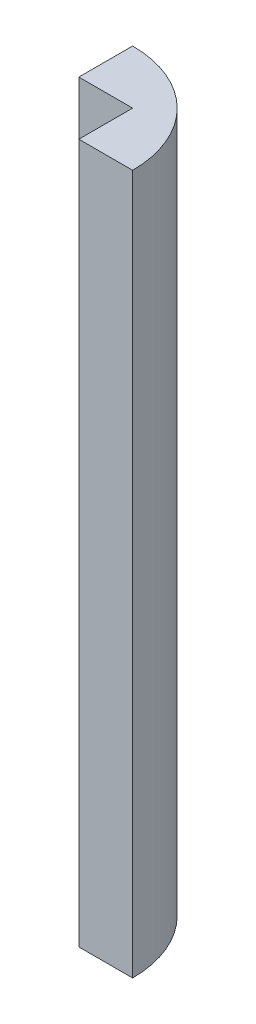
ISO-10303-21;
HEADER;
FILE_DESCRIPTION(('STEP AP214'),'2;1');
FILE_NAME('part.step','',(''),(''),'','','');
FILE_SCHEMA(('AUTOMOTIVE_DESIGN { 1 0 10303 214 1 1 1 1 }'));
ENDSEC;
DATA;
#1=APPLICATION_CONTEXT('core data for automotive mechanical design processes');
#2=APPLICATION_PROTOCOL_DEFINITION('international standard','automotive_design',2000,#1);
#3=PRODUCT_CONTEXT('',#1,'mechanical');
#4=PRODUCT('Part','Part','',(#3));
#5=PRODUCT_RELATED_PRODUCT_CATEGORY('part','',(#4));
#6=PRODUCT_DEFINITION_FORMATION('','',#4);
#7=PRODUCT_DEFINITION_CONTEXT('part definition',#1,'design');
#8=PRODUCT_DEFINITION('design','',#6,#7);
#9=PRODUCT_DEFINITION_SHAPE('','',#8);
#10=(LENGTH_UNIT() NAMED_UNIT(*) SI_UNIT(.MILLI.,.METRE.));
#11=(NAMED_UNIT(*) PLANE_ANGLE_UNIT() SI_UNIT($,.RADIAN.));
#12=(NAMED_UNIT(*) SI_UNIT($,.STERADIAN.) SOLID_ANGLE_UNIT());
#13=UNCERTAINTY_MEASURE_WITH_UNIT(LENGTH_MEASURE(1.E-05),#10,'distance_accuracy_value','');
#14=(GEOMETRIC_REPRESENTATION_CONTEXT(3) GLOBAL_UNCERTAINTY_ASSIGNED_CONTEXT((#13)) GLOBAL_UNIT_ASSIGNED_CONTEXT((#10,
#11,#12)) REPRESENTATION_CONTEXT('',''));
#15=CARTESIAN_POINT('',(0.,0.,0.));
#16=DIRECTION('',(0.,0.,1.));
#17=DIRECTION('',(1.,0.,0.));
#18=AXIS2_PLACEMENT_3D('',#15,#16,#17);
#19=CARTESIAN_POINT('',(10.,130.,0.));
#20=DIRECTION('',(1.,0.,0.));
#21=DIRECTION('',(0.,0.,-1.));
#22=AXIS2_PLACEMENT_3D('',#19,#20,#21);
#23=PLANE('',#22);
#24=DIRECTION('',(0.,0.,1.));
#25=VECTOR('',#24,1.);
#26=CARTESIAN_POINT('',(10.,0.,0.));
#27=LINE('',#26,#25);
#28=CARTESIAN_POINT('',(10.,0.,-10.));
#29=VERTEX_POINT('',#28);
#30=CARTESIAN_POINT('',(10.,0.,0.));
#31=VERTEX_POINT('',#30);
#32=EDGE_CURVE('E118',#29,#31,#27,.T.);
#33=ORIENTED_EDGE('',*,*,#32,.T.);
#34=DIRECTION('',(0.,-1.,0.));
#35=VECTOR('',#34,1.);
#36=CARTESIAN_POINT('',(10.,130.,0.));
#37=LINE('',#36,#35);
#38=CARTESIAN_POINT('',(10.,130.,0.));
#39=VERTEX_POINT('',#38);
#40=EDGE_CURVE('E11',#39,#31,#37,.T.);
#41=ORIENTED_EDGE('',*,*,#40,.F.);
#42=DIRECTION('',(0.,0.,1.));
#43=VECTOR('',#42,1.);
#44=CARTESIAN_POINT('',(10.,130.,0.));
#45=LINE('',#44,#43);
#46=CARTESIAN_POINT('',(10.,130.,-10.));
#47=VERTEX_POINT('',#46);
#48=EDGE_CURVE('E131',#47,#39,#45,.T.);
#49=ORIENTED_EDGE('',*,*,#48,.F.);
#50=DIRECTION('',(0.,-1.,0.));
#51=VECTOR('',#50,1.);
#52=CARTESIAN_POINT('',(10.,130.,-10.));
#53=LINE('',#52,#51);
#54=EDGE_CURVE('E114',#47,#29,#53,.T.);
#55=ORIENTED_EDGE('',*,*,#54,.T.);
#56=EDGE_LOOP('',(#33,#41,#49,#55));
#57=FACE_BOUND('',#56,.T.);
#58=ADVANCED_FACE('F39',(#57),#23,.F.);
#59=CARTESIAN_POINT('',(10.,130.,0.));
#60=DIRECTION('',(0.,0.,-1.));
#61=DIRECTION('',(-1.,0.,0.));
#62=AXIS2_PLACEMENT_3D('',#59,#60,#61);
#63=PLANE('',#62);
#64=DIRECTION('',(1.,0.,0.));
#65=VECTOR('',#64,1.);
#66=CARTESIAN_POINT('',(10.,0.,0.));
#67=LINE('',#66,#65);
#68=CARTESIAN_POINT('',(20.,0.,0.));
#69=VERTEX_POINT('',#68);
#70=EDGE_CURVE('E122',#31,#69,#67,.T.);
#71=ORIENTED_EDGE('',*,*,#70,.T.);
#72=DIRECTION('',(0.,-1.,0.));
#73=VECTOR('',#72,1.);
#74=CARTESIAN_POINT('',(20.,130.,0.));
#75=LINE('',#74,#73);
#76=CARTESIAN_POINT('',(20.,130.,0.));
#77=VERTEX_POINT('',#76);
#78=EDGE_CURVE('E48',#77,#69,#75,.T.);
#79=ORIENTED_EDGE('',*,*,#78,.F.);
#80=DIRECTION('',(1.,0.,0.));
#81=VECTOR('',#80,1.);
#82=CARTESIAN_POINT('',(10.,130.,0.));
#83=LINE('',#82,#81);
#84=EDGE_CURVE('E90',#39,#77,#83,.T.);
#85=ORIENTED_EDGE('',*,*,#84,.F.);
#86=ORIENTED_EDGE('',*,*,#40,.T.);
#87=EDGE_LOOP('',(#71,#79,#85,#86));
#88=FACE_BOUND('',#87,.T.);
#89=ADVANCED_FACE('F153',(#88),#63,.F.);
#90=CARTESIAN_POINT('',(0.,130.,0.));
#91=DIRECTION('',(0.,-1.,0.));
#92=DIRECTION('',(0.,0.,-1.));
#93=AXIS2_PLACEMENT_3D('',#90,#91,#92);
#94=CYLINDRICAL_SURFACE('',#93,20.);
#95=CARTESIAN_POINT('',(0.,0.,0.));
#96=DIRECTION('',(0.,1.,0.));
#97=DIRECTION('',(0.,0.,1.));
#98=AXIS2_PLACEMENT_3D('',#95,#96,#97);
#99=CIRCLE('',#98,20.);
#100=CARTESIAN_POINT('',(0.,0.,-20.));
#101=VERTEX_POINT('',#100);
#102=EDGE_CURVE('E106',#69,#101,#99,.T.);
#103=ORIENTED_EDGE('',*,*,#102,.T.);
#104=DIRECTION('',(0.,-1.,0.));
#105=VECTOR('',#104,1.);
#106=CARTESIAN_POINT('',(0.,130.,-20.));
#107=LINE('',#106,#105);
#108=CARTESIAN_POINT('',(0.,130.,-20.));
#109=VERTEX_POINT('',#108);
#110=EDGE_CURVE('E103',#109,#101,#107,.T.);
#111=ORIENTED_EDGE('',*,*,#110,.F.);
#112=CARTESIAN_POINT('',(0.,130.,0.));
#113=DIRECTION('',(0.,1.,0.));
#114=DIRECTION('',(0.,0.,1.));
#115=AXIS2_PLACEMENT_3D('',#112,#113,#114);
#116=CIRCLE('',#115,20.);
#117=EDGE_CURVE('E94',#77,#109,#116,.T.);
#118=ORIENTED_EDGE('',*,*,#117,.F.);
#119=ORIENTED_EDGE('',*,*,#78,.T.);
#120=EDGE_LOOP('',(#103,#111,#118,#119));
#121=FACE_BOUND('',#120,.T.);
#122=ADVANCED_FACE('F104',(#121),#94,.T.);
#123=CARTESIAN_POINT('',(0.,130.,-10.));
#124=DIRECTION('',(1.,0.,0.));
#125=DIRECTION('',(0.,0.,-1.));
#126=AXIS2_PLACEMENT_3D('',#123,#124,#125);
#127=PLANE('',#126);
#128=DIRECTION('',(0.,0.,1.));
#129=VECTOR('',#128,1.);
#130=CARTESIAN_POINT('',(0.,0.,-10.));
#131=LINE('',#130,#129);
#132=CARTESIAN_POINT('',(0.,0.,-10.));
#133=VERTEX_POINT('',#132);
#134=EDGE_CURVE('E76',#101,#133,#131,.T.);
#135=ORIENTED_EDGE('',*,*,#134,.T.);
#136=DIRECTION('',(0.,-1.,0.));
#137=VECTOR('',#136,1.);
#138=CARTESIAN_POINT('',(0.,130.,-10.));
#139=LINE('',#138,#137);
#140=CARTESIAN_POINT('',(0.,130.,-10.));
#141=VERTEX_POINT('',#140);
#142=EDGE_CURVE('E108',#141,#133,#139,.T.);
#143=ORIENTED_EDGE('',*,*,#142,.F.);
#144=DIRECTION('',(0.,0.,1.));
#145=VECTOR('',#144,1.);
#146=CARTESIAN_POINT('',(0.,130.,-10.));
#147=LINE('',#146,#145);
#148=EDGE_CURVE('E98',#109,#141,#147,.T.);
#149=ORIENTED_EDGE('',*,*,#148,.F.);
#150=ORIENTED_EDGE('',*,*,#110,.T.);
#151=EDGE_LOOP('',(#135,#143,#149,#150));
#152=FACE_BOUND('',#151,.T.);
#153=ADVANCED_FACE('F110',(#152),#127,.F.);
#154=CARTESIAN_POINT('',(0.,130.,-10.));
#155=DIRECTION('',(0.,0.,-1.));
#156=DIRECTION('',(-1.,0.,0.));
#157=AXIS2_PLACEMENT_3D('',#154,#155,#156);
#158=PLANE('',#157);
#159=DIRECTION('',(1.,0.,0.));
#160=VECTOR('',#159,1.);
#161=CARTESIAN_POINT('',(0.,0.,-10.));
#162=LINE('',#161,#160);
#163=EDGE_CURVE('E82',#133,#29,#162,.T.);
#164=ORIENTED_EDGE('',*,*,#163,.T.);
#165=ORIENTED_EDGE('',*,*,#54,.F.);
#166=DIRECTION('',(1.,0.,0.));
#167=VECTOR('',#166,1.);
#168=CARTESIAN_POINT('',(0.,130.,-10.));
#169=LINE('',#168,#167);
#170=EDGE_CURVE('E56',#141,#47,#169,.T.);
#171=ORIENTED_EDGE('',*,*,#170,.F.);
#172=ORIENTED_EDGE('',*,*,#142,.T.);
#173=EDGE_LOOP('',(#164,#165,#171,#172));
#174=FACE_BOUND('',#173,.T.);
#175=ADVANCED_FACE('F142',(#174),#158,.F.);
#176=CARTESIAN_POINT('',(0.,130.,0.));
#177=DIRECTION('',(0.,1.,0.));
#178=DIRECTION('',(0.,0.,1.));
#179=AXIS2_PLACEMENT_3D('',#176,#177,#178);
#180=PLANE('',#179);
#181=ORIENTED_EDGE('',*,*,#48,.T.);
#182=ORIENTED_EDGE('',*,*,#84,.T.);
#183=ORIENTED_EDGE('',*,*,#117,.T.);
#184=ORIENTED_EDGE('',*,*,#148,.T.);
#185=ORIENTED_EDGE('',*,*,#170,.T.);
#186=EDGE_LOOP('',(#181,#182,#183,#184,#185));
#187=FACE_BOUND('',#186,.T.);
#188=ADVANCED_FACE('F96',(#187),#180,.T.);
#189=CARTESIAN_POINT('',(0.,0.,0.));
#190=DIRECTION('',(0.,1.,0.));
#191=DIRECTION('',(0.,0.,1.));
#192=AXIS2_PLACEMENT_3D('',#189,#190,#191);
#193=PLANE('',#192);
#194=ORIENTED_EDGE('',*,*,#32,.F.);
#195=ORIENTED_EDGE('',*,*,#163,.F.);
#196=ORIENTED_EDGE('',*,*,#134,.F.);
#197=ORIENTED_EDGE('',*,*,#102,.F.);
#198=ORIENTED_EDGE('',*,*,#70,.F.);
#199=EDGE_LOOP('',(#194,#195,#196,#197,#198));
#200=FACE_BOUND('',#199,.T.);
#201=ADVANCED_FACE('F138',(#200),#193,.F.);
#202=CLOSED_SHELL('',(#58,#89,#122,#153,#175,#188,#201));
#203=MANIFOLD_SOLID_BREP('B2',#202);
#204=ADVANCED_BREP_SHAPE_REPRESENTATION('',(#18,#203),#14);
#205=SHAPE_DEFINITION_REPRESENTATION(#9,#204);
ENDSEC;
END-ISO-10303-21;
